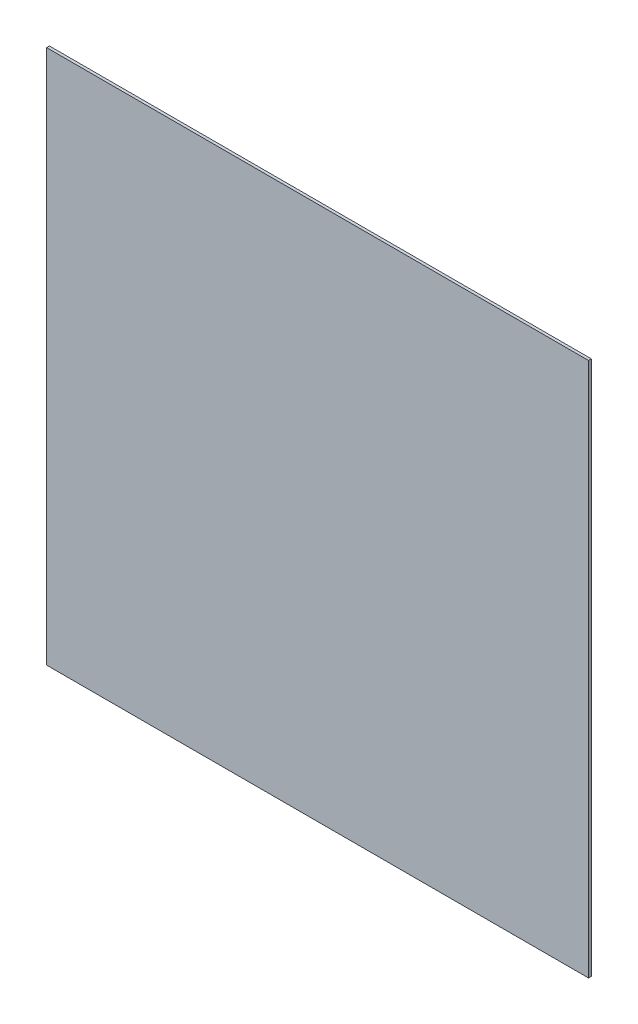
ISO-10303-21;
HEADER;
FILE_DESCRIPTION(('STEP AP214'),'2;1');
FILE_NAME('part.step','',(''),(''),'','','');
FILE_SCHEMA(('AUTOMOTIVE_DESIGN { 1 0 10303 214 1 1 1 1 }'));
ENDSEC;
DATA;
#1=APPLICATION_CONTEXT('core data for automotive mechanical design processes');
#2=APPLICATION_PROTOCOL_DEFINITION('international standard','automotive_design',2000,#1);
#3=PRODUCT_CONTEXT('',#1,'mechanical');
#4=PRODUCT('Part','Part','',(#3));
#5=PRODUCT_RELATED_PRODUCT_CATEGORY('part','',(#4));
#6=PRODUCT_DEFINITION_FORMATION('','',#4);
#7=PRODUCT_DEFINITION_CONTEXT('part definition',#1,'design');
#8=PRODUCT_DEFINITION('design','',#6,#7);
#9=PRODUCT_DEFINITION_SHAPE('','',#8);
#10=(LENGTH_UNIT() NAMED_UNIT(*) SI_UNIT(.MILLI.,.METRE.));
#11=(NAMED_UNIT(*) PLANE_ANGLE_UNIT() SI_UNIT($,.RADIAN.));
#12=(NAMED_UNIT(*) SI_UNIT($,.STERADIAN.) SOLID_ANGLE_UNIT());
#13=UNCERTAINTY_MEASURE_WITH_UNIT(LENGTH_MEASURE(1.E-05),#10,'distance_accuracy_value','');
#14=(GEOMETRIC_REPRESENTATION_CONTEXT(3) GLOBAL_UNCERTAINTY_ASSIGNED_CONTEXT((#13)) GLOBAL_UNIT_ASSIGNED_CONTEXT((#10,
#11,#12)) REPRESENTATION_CONTEXT('',''));
#15=CARTESIAN_POINT('',(0.,0.,0.));
#16=DIRECTION('',(0.,0.,1.));
#17=DIRECTION('',(1.,0.,0.));
#18=AXIS2_PLACEMENT_3D('',#15,#16,#17);
#19=CARTESIAN_POINT('',(-385.,380.,4.));
#20=DIRECTION('',(1.,0.,0.));
#21=DIRECTION('',(0.,0.,-1.));
#22=AXIS2_PLACEMENT_3D('',#19,#20,#21);
#23=PLANE('',#22);
#24=DIRECTION('',(0.,-1.,0.));
#25=VECTOR('',#24,1.);
#26=CARTESIAN_POINT('',(-385.,380.,0.));
#27=LINE('',#26,#25);
#28=CARTESIAN_POINT('',(-385.,380.,0.));
#29=VERTEX_POINT('',#28);
#30=CARTESIAN_POINT('',(-385.,-380.,0.));
#31=VERTEX_POINT('',#30);
#32=EDGE_CURVE('E95',#29,#31,#27,.T.);
#33=ORIENTED_EDGE('',*,*,#32,.T.);
#34=DIRECTION('',(0.,0.,-1.));
#35=VECTOR('',#34,1.);
#36=CARTESIAN_POINT('',(-385.,-380.,4.));
#37=LINE('',#36,#35);
#38=CARTESIAN_POINT('',(-385.,-380.,4.));
#39=VERTEX_POINT('',#38);
#40=EDGE_CURVE('E11',#39,#31,#37,.T.);
#41=ORIENTED_EDGE('',*,*,#40,.F.);
#42=DIRECTION('',(0.,-1.,0.));
#43=VECTOR('',#42,1.);
#44=CARTESIAN_POINT('',(-385.,380.,4.));
#45=LINE('',#44,#43);
#46=CARTESIAN_POINT('',(-385.,380.,4.));
#47=VERTEX_POINT('',#46);
#48=EDGE_CURVE('E83',#47,#39,#45,.T.);
#49=ORIENTED_EDGE('',*,*,#48,.F.);
#50=DIRECTION('',(0.,0.,-1.));
#51=VECTOR('',#50,1.);
#52=CARTESIAN_POINT('',(-385.,380.,4.));
#53=LINE('',#52,#51);
#54=EDGE_CURVE('E91',#47,#29,#53,.T.);
#55=ORIENTED_EDGE('',*,*,#54,.T.);
#56=EDGE_LOOP('',(#33,#41,#49,#55));
#57=FACE_BOUND('',#56,.T.);
#58=ADVANCED_FACE('F32',(#57),#23,.F.);
#59=CARTESIAN_POINT('',(-385.,-380.,4.));
#60=DIRECTION('',(0.,1.,0.));
#61=DIRECTION('',(-1.,0.,0.));
#62=AXIS2_PLACEMENT_3D('',#59,#60,#61);
#63=PLANE('',#62);
#64=DIRECTION('',(1.,0.,0.));
#65=VECTOR('',#64,1.);
#66=CARTESIAN_POINT('',(-385.,-380.,0.));
#67=LINE('',#66,#65);
#68=CARTESIAN_POINT('',(385.,-380.,0.));
#69=VERTEX_POINT('',#68);
#70=EDGE_CURVE('E87',#31,#69,#67,.T.);
#71=ORIENTED_EDGE('',*,*,#70,.T.);
#72=DIRECTION('',(0.,0.,-1.));
#73=VECTOR('',#72,1.);
#74=CARTESIAN_POINT('',(385.,-380.,4.));
#75=LINE('',#74,#73);
#76=CARTESIAN_POINT('',(385.,-380.,4.));
#77=VERTEX_POINT('',#76);
#78=EDGE_CURVE('E40',#77,#69,#75,.T.);
#79=ORIENTED_EDGE('',*,*,#78,.F.);
#80=DIRECTION('',(1.,0.,0.));
#81=VECTOR('',#80,1.);
#82=CARTESIAN_POINT('',(-385.,-380.,4.));
#83=LINE('',#82,#81);
#84=EDGE_CURVE('E78',#39,#77,#83,.T.);
#85=ORIENTED_EDGE('',*,*,#84,.F.);
#86=ORIENTED_EDGE('',*,*,#40,.T.);
#87=EDGE_LOOP('',(#71,#79,#85,#86));
#88=FACE_BOUND('',#87,.T.);
#89=ADVANCED_FACE('F86',(#88),#63,.F.);
#90=CARTESIAN_POINT('',(385.,380.,4.));
#91=DIRECTION('',(-1.,0.,0.));
#92=DIRECTION('',(0.,-1.,0.));
#93=AXIS2_PLACEMENT_3D('',#90,#91,#92);
#94=PLANE('',#93);
#95=DIRECTION('',(0.,1.,0.));
#96=VECTOR('',#95,1.);
#97=CARTESIAN_POINT('',(385.,380.,0.));
#98=LINE('',#97,#96);
#99=CARTESIAN_POINT('',(385.,380.,0.));
#100=VERTEX_POINT('',#99);
#101=EDGE_CURVE('E65',#69,#100,#98,.T.);
#102=ORIENTED_EDGE('',*,*,#101,.T.);
#103=DIRECTION('',(0.,0.,-1.));
#104=VECTOR('',#103,1.);
#105=CARTESIAN_POINT('',(385.,380.,4.));
#106=LINE('',#105,#104);
#107=CARTESIAN_POINT('',(385.,380.,4.));
#108=VERTEX_POINT('',#107);
#109=EDGE_CURVE('E88',#108,#100,#106,.T.);
#110=ORIENTED_EDGE('',*,*,#109,.F.);
#111=DIRECTION('',(0.,1.,0.));
#112=VECTOR('',#111,1.);
#113=CARTESIAN_POINT('',(385.,380.,4.));
#114=LINE('',#113,#112);
#115=EDGE_CURVE('E81',#77,#108,#114,.T.);
#116=ORIENTED_EDGE('',*,*,#115,.F.);
#117=ORIENTED_EDGE('',*,*,#78,.T.);
#118=EDGE_LOOP('',(#102,#110,#116,#117));
#119=FACE_BOUND('',#118,.T.);
#120=ADVANCED_FACE('F89',(#119),#94,.F.);
#121=CARTESIAN_POINT('',(-385.,380.,4.));
#122=DIRECTION('',(0.,-1.,0.));
#123=DIRECTION('',(1.,0.,0.));
#124=AXIS2_PLACEMENT_3D('',#121,#122,#123);
#125=PLANE('',#124);
#126=DIRECTION('',(-1.,0.,0.));
#127=VECTOR('',#126,1.);
#128=CARTESIAN_POINT('',(-385.,380.,0.));
#129=LINE('',#128,#127);
#130=EDGE_CURVE('E71',#100,#29,#129,.T.);
#131=ORIENTED_EDGE('',*,*,#130,.T.);
#132=ORIENTED_EDGE('',*,*,#54,.F.);
#133=DIRECTION('',(-1.,0.,0.));
#134=VECTOR('',#133,1.);
#135=CARTESIAN_POINT('',(-385.,380.,4.));
#136=LINE('',#135,#134);
#137=EDGE_CURVE('E48',#108,#47,#136,.T.);
#138=ORIENTED_EDGE('',*,*,#137,.F.);
#139=ORIENTED_EDGE('',*,*,#109,.T.);
#140=EDGE_LOOP('',(#131,#132,#138,#139));
#141=FACE_BOUND('',#140,.T.);
#142=ADVANCED_FACE('F102',(#141),#125,.F.);
#143=CARTESIAN_POINT('',(0.,0.,4.));
#144=DIRECTION('',(0.,0.,1.));
#145=DIRECTION('',(1.,0.,0.));
#146=AXIS2_PLACEMENT_3D('',#143,#144,#145);
#147=PLANE('',#146);
#148=ORIENTED_EDGE('',*,*,#48,.T.);
#149=ORIENTED_EDGE('',*,*,#84,.T.);
#150=ORIENTED_EDGE('',*,*,#115,.T.);
#151=ORIENTED_EDGE('',*,*,#137,.T.);
#152=EDGE_LOOP('',(#148,#149,#150,#151));
#153=FACE_BOUND('',#152,.T.);
#154=ADVANCED_FACE('F79',(#153),#147,.T.);
#155=CARTESIAN_POINT('',(0.,0.,0.));
#156=DIRECTION('',(0.,0.,1.));
#157=DIRECTION('',(1.,0.,0.));
#158=AXIS2_PLACEMENT_3D('',#155,#156,#157);
#159=PLANE('',#158);
#160=ORIENTED_EDGE('',*,*,#32,.F.);
#161=ORIENTED_EDGE('',*,*,#130,.F.);
#162=ORIENTED_EDGE('',*,*,#101,.F.);
#163=ORIENTED_EDGE('',*,*,#70,.F.);
#164=EDGE_LOOP('',(#160,#161,#162,#163));
#165=FACE_BOUND('',#164,.T.);
#166=ADVANCED_FACE('F105',(#165),#159,.F.);
#167=CLOSED_SHELL('',(#58,#89,#120,#142,#154,#166));
#168=MANIFOLD_SOLID_BREP('B2',#167);
#169=ADVANCED_BREP_SHAPE_REPRESENTATION('',(#18,#168),#14);
#170=SHAPE_DEFINITION_REPRESENTATION(#9,#169);
ENDSEC;
END-ISO-10303-21;
